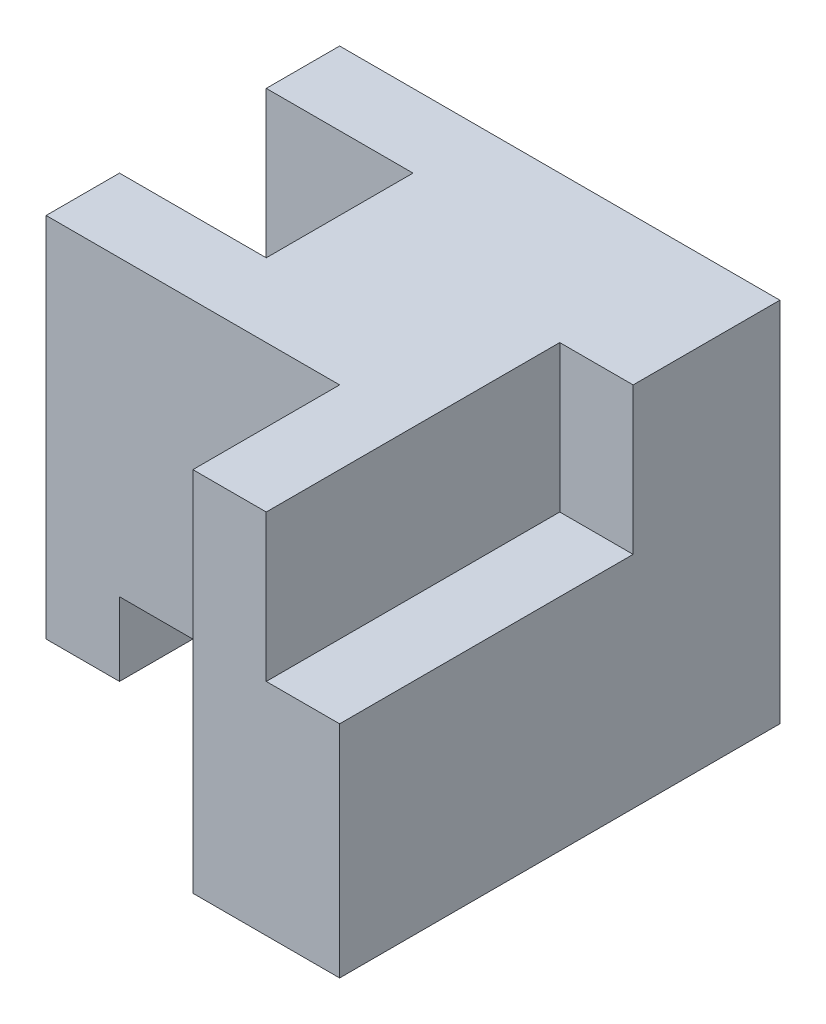
ISO-10303-21;
HEADER;
FILE_DESCRIPTION(('STEP AP214'),'2;1');
FILE_NAME('part.step','',(''),(''),'','','');
FILE_SCHEMA(('AUTOMOTIVE_DESIGN { 1 0 10303 214 1 1 1 1 }'));
ENDSEC;
DATA;
#1=APPLICATION_CONTEXT('core data for automotive mechanical design processes');
#2=APPLICATION_PROTOCOL_DEFINITION('international standard','automotive_design',2000,#1);
#3=PRODUCT_CONTEXT('',#1,'mechanical');
#4=PRODUCT('Part','Part','',(#3));
#5=PRODUCT_RELATED_PRODUCT_CATEGORY('part','',(#4));
#6=PRODUCT_DEFINITION_FORMATION('','',#4);
#7=PRODUCT_DEFINITION_CONTEXT('part definition',#1,'design');
#8=PRODUCT_DEFINITION('design','',#6,#7);
#9=PRODUCT_DEFINITION_SHAPE('','',#8);
#10=(LENGTH_UNIT() NAMED_UNIT(*) SI_UNIT(.MILLI.,.METRE.));
#11=(NAMED_UNIT(*) PLANE_ANGLE_UNIT() SI_UNIT($,.RADIAN.));
#12=(NAMED_UNIT(*) SI_UNIT($,.STERADIAN.) SOLID_ANGLE_UNIT());
#13=UNCERTAINTY_MEASURE_WITH_UNIT(LENGTH_MEASURE(1.E-05),#10,'distance_accuracy_value','');
#14=(GEOMETRIC_REPRESENTATION_CONTEXT(3) GLOBAL_UNCERTAINTY_ASSIGNED_CONTEXT((#13)) GLOBAL_UNIT_ASSIGNED_CONTEXT((#10,
#11,#12)) REPRESENTATION_CONTEXT('',''));
#15=CARTESIAN_POINT('',(0.,0.,0.));
#16=DIRECTION('',(0.,0.,1.));
#17=DIRECTION('',(1.,0.,0.));
#18=AXIS2_PLACEMENT_3D('',#15,#16,#17);
#19=CARTESIAN_POINT('',(80.,0.,120.));
#20=DIRECTION('',(-1.,0.,0.));
#21=DIRECTION('',(0.,0.,1.));
#22=AXIS2_PLACEMENT_3D('',#19,#20,#21);
#23=PLANE('',#22);
#24=DIRECTION('',(0.,0.,-1.));
#25=VECTOR('',#24,1.);
#26=CARTESIAN_POINT('',(80.,100.,120.));
#27=LINE('',#26,#25);
#28=CARTESIAN_POINT('',(80.,100.,120.));
#29=VERTEX_POINT('',#28);
#30=CARTESIAN_POINT('',(80.,100.,-40.));
#31=VERTEX_POINT('',#30);
#32=EDGE_CURVE('E248',#29,#31,#27,.T.);
#33=ORIENTED_EDGE('',*,*,#32,.F.);
#34=DIRECTION('',(0.,1.,0.));
#35=VECTOR('',#34,1.);
#36=CARTESIAN_POINT('',(80.,0.,120.));
#37=LINE('',#36,#35);
#38=CARTESIAN_POINT('',(80.,20.,120.));
#39=VERTEX_POINT('',#38);
#40=EDGE_CURVE('E196',#39,#29,#37,.T.);
#41=ORIENTED_EDGE('',*,*,#40,.F.);
#42=DIRECTION('',(0.,0.,-1.));
#43=VECTOR('',#42,1.);
#44=CARTESIAN_POINT('',(80.,20.,120.));
#45=LINE('',#44,#43);
#46=CARTESIAN_POINT('',(80.,20.,-40.));
#47=VERTEX_POINT('',#46);
#48=EDGE_CURVE('E250',#39,#47,#45,.T.);
#49=ORIENTED_EDGE('',*,*,#48,.T.);
#50=DIRECTION('',(0.,-1.,0.));
#51=VECTOR('',#50,1.);
#52=CARTESIAN_POINT('',(80.,100.,-40.));
#53=LINE('',#52,#51);
#54=EDGE_CURVE('E229',#31,#47,#53,.T.);
#55=ORIENTED_EDGE('',*,*,#54,.F.);
#56=EDGE_LOOP('',(#33,#41,#49,#55));
#57=FACE_BOUND('',#56,.T.);
#58=ADVANCED_FACE('F38',(#57),#23,.F.);
#59=CARTESIAN_POINT('',(120.,100.,-40.));
#60=DIRECTION('',(0.,0.,-1.));
#61=DIRECTION('',(-1.,0.,0.));
#62=AXIS2_PLACEMENT_3D('',#59,#60,#61);
#63=PLANE('',#62);
#64=ORIENTED_EDGE('',*,*,#54,.T.);
#65=DIRECTION('',(-1.,0.,0.));
#66=VECTOR('',#65,1.);
#67=CARTESIAN_POINT('',(120.,20.,-40.));
#68=LINE('',#67,#66);
#69=CARTESIAN_POINT('',(120.,20.,-40.));
#70=VERTEX_POINT('',#69);
#71=EDGE_CURVE('E240',#70,#47,#68,.T.);
#72=ORIENTED_EDGE('',*,*,#71,.F.);
#73=DIRECTION('',(0.,-1.,0.));
#74=VECTOR('',#73,1.);
#75=CARTESIAN_POINT('',(120.,100.,-40.));
#76=LINE('',#75,#74);
#77=CARTESIAN_POINT('',(120.,100.,-40.));
#78=VERTEX_POINT('',#77);
#79=EDGE_CURVE('E237',#78,#70,#76,.T.);
#80=ORIENTED_EDGE('',*,*,#79,.F.);
#81=DIRECTION('',(-1.,0.,0.));
#82=VECTOR('',#81,1.);
#83=CARTESIAN_POINT('',(120.,100.,-40.));
#84=LINE('',#83,#82);
#85=EDGE_CURVE('E245',#78,#31,#84,.T.);
#86=ORIENTED_EDGE('',*,*,#85,.T.);
#87=EDGE_LOOP('',(#64,#72,#80,#86));
#88=FACE_BOUND('',#87,.T.);
#89=ADVANCED_FACE('F330',(#88),#63,.F.);
#90=CARTESIAN_POINT('',(40.,0.,120.));
#91=DIRECTION('',(1.,0.,0.));
#92=DIRECTION('',(0.,1.,0.));
#93=AXIS2_PLACEMENT_3D('',#90,#91,#92);
#94=PLANE('',#93);
#95=DIRECTION('',(0.,0.,-1.));
#96=VECTOR('',#95,1.);
#97=CARTESIAN_POINT('',(40.,-100.,120.));
#98=LINE('',#97,#96);
#99=CARTESIAN_POINT('',(40.,-100.,120.));
#100=VERTEX_POINT('',#99);
#101=CARTESIAN_POINT('',(40.,-100.,-120.));
#102=VERTEX_POINT('',#101);
#103=EDGE_CURVE('E256',#100,#102,#98,.T.);
#104=ORIENTED_EDGE('',*,*,#103,.F.);
#105=DIRECTION('',(0.,-1.,0.));
#106=VECTOR('',#105,1.);
#107=CARTESIAN_POINT('',(40.,0.,120.));
#108=LINE('',#107,#106);
#109=CARTESIAN_POINT('',(40.,100.,120.));
#110=VERTEX_POINT('',#109);
#111=EDGE_CURVE('E167',#110,#100,#108,.T.);
#112=ORIENTED_EDGE('',*,*,#111,.F.);
#113=DIRECTION('',(0.,0.,-1.));
#114=VECTOR('',#113,1.);
#115=CARTESIAN_POINT('',(40.,100.,120.));
#116=LINE('',#115,#114);
#117=CARTESIAN_POINT('',(40.,100.,40.));
#118=VERTEX_POINT('',#117);
#119=EDGE_CURVE('E156',#110,#118,#116,.T.);
#120=ORIENTED_EDGE('',*,*,#119,.T.);
#121=DIRECTION('',(0.,-1.,0.));
#122=VECTOR('',#121,1.);
#123=CARTESIAN_POINT('',(40.,0.,40.));
#124=LINE('',#123,#122);
#125=CARTESIAN_POINT('',(40.,-60.,40.));
#126=VERTEX_POINT('',#125);
#127=EDGE_CURVE('E182',#118,#126,#124,.T.);
#128=ORIENTED_EDGE('',*,*,#127,.T.);
#129=DIRECTION('',(0.,0.,-1.));
#130=VECTOR('',#129,1.);
#131=CARTESIAN_POINT('',(40.,-60.,40.));
#132=LINE('',#131,#130);
#133=CARTESIAN_POINT('',(40.,-60.,-120.));
#134=VERTEX_POINT('',#133);
#135=EDGE_CURVE('E213',#126,#134,#132,.T.);
#136=ORIENTED_EDGE('',*,*,#135,.T.);
#137=DIRECTION('',(0.,-1.,0.));
#138=VECTOR('',#137,1.);
#139=CARTESIAN_POINT('',(40.,0.,-120.));
#140=LINE('',#139,#138);
#141=EDGE_CURVE('E290',#134,#102,#140,.T.);
#142=ORIENTED_EDGE('',*,*,#141,.T.);
#143=EDGE_LOOP('',(#104,#112,#120,#128,#136,#142));
#144=FACE_BOUND('',#143,.T.);
#145=ADVANCED_FACE('F211',(#144),#94,.F.);
#146=CARTESIAN_POINT('',(0.,100.,120.));
#147=DIRECTION('',(0.,-1.,0.));
#148=DIRECTION('',(1.,0.,0.));
#149=AXIS2_PLACEMENT_3D('',#146,#147,#148);
#150=PLANE('',#149);
#151=DIRECTION('',(0.,0.,1.));
#152=VECTOR('',#151,1.);
#153=CARTESIAN_POINT('',(120.,100.,-40.));
#154=LINE('',#153,#152);
#155=CARTESIAN_POINT('',(120.,100.,-120.));
#156=VERTEX_POINT('',#155);
#157=EDGE_CURVE('E235',#156,#78,#154,.T.);
#158=ORIENTED_EDGE('',*,*,#157,.F.);
#159=DIRECTION('',(-1.,0.,0.));
#160=VECTOR('',#159,1.);
#161=CARTESIAN_POINT('',(0.,100.,-120.));
#162=LINE('',#161,#160);
#163=CARTESIAN_POINT('',(-120.,100.,-120.));
#164=VERTEX_POINT('',#163);
#165=EDGE_CURVE('E284',#156,#164,#162,.T.);
#166=ORIENTED_EDGE('',*,*,#165,.T.);
#167=DIRECTION('',(0.,0.,-1.));
#168=VECTOR('',#167,1.);
#169=CARTESIAN_POINT('',(-120.,100.,40.));
#170=LINE('',#169,#168);
#171=CARTESIAN_POINT('',(-120.,100.,-80.));
#172=VERTEX_POINT('',#171);
#173=EDGE_CURVE('E282',#172,#164,#170,.T.);
#174=ORIENTED_EDGE('',*,*,#173,.F.);
#175=DIRECTION('',(-1.,0.,0.));
#176=VECTOR('',#175,1.);
#177=CARTESIAN_POINT('',(0.,100.,-80.));
#178=LINE('',#177,#176);
#179=CARTESIAN_POINT('',(-39.9999999999997,100.,-80.));
#180=VERTEX_POINT('',#179);
#181=EDGE_CURVE('E271',#180,#172,#178,.T.);
#182=ORIENTED_EDGE('',*,*,#181,.F.);
#183=DIRECTION('',(0.,0.,1.));
#184=VECTOR('',#183,1.);
#185=CARTESIAN_POINT('',(-39.9999999999997,100.,120.));
#186=LINE('',#185,#184);
#187=CARTESIAN_POINT('',(-39.9999999999997,100.,0.));
#188=VERTEX_POINT('',#187);
#189=EDGE_CURVE('E47',#180,#188,#186,.T.);
#190=ORIENTED_EDGE('',*,*,#189,.T.);
#191=DIRECTION('',(-1.,0.,0.));
#192=VECTOR('',#191,1.);
#193=CARTESIAN_POINT('',(0.,100.,0.));
#194=LINE('',#193,#192);
#195=CARTESIAN_POINT('',(-120.,100.,0.));
#196=VERTEX_POINT('',#195);
#197=EDGE_CURVE('E144',#188,#196,#194,.T.);
#198=ORIENTED_EDGE('',*,*,#197,.T.);
#199=DIRECTION('',(0.,0.,-1.));
#200=VECTOR('',#199,1.);
#201=CARTESIAN_POINT('',(-120.,100.,40.));
#202=LINE('',#201,#200);
#203=CARTESIAN_POINT('',(-120.,100.,40.));
#204=VERTEX_POINT('',#203);
#205=EDGE_CURVE('E148',#204,#196,#202,.T.);
#206=ORIENTED_EDGE('',*,*,#205,.F.);
#207=DIRECTION('',(-1.,0.,0.));
#208=VECTOR('',#207,1.);
#209=CARTESIAN_POINT('',(0.,100.,40.));
#210=LINE('',#209,#208);
#211=EDGE_CURVE('E183',#118,#204,#210,.T.);
#212=ORIENTED_EDGE('',*,*,#211,.F.);
#213=ORIENTED_EDGE('',*,*,#119,.F.);
#214=DIRECTION('',(-1.,0.,0.));
#215=VECTOR('',#214,1.);
#216=CARTESIAN_POINT('',(0.,100.,120.));
#217=LINE('',#216,#215);
#218=EDGE_CURVE('E162',#29,#110,#217,.T.);
#219=ORIENTED_EDGE('',*,*,#218,.F.);
#220=ORIENTED_EDGE('',*,*,#32,.T.);
#221=ORIENTED_EDGE('',*,*,#85,.F.);
#222=EDGE_LOOP('',(#158,#166,#174,#182,#190,#198,#206,#212,#213,#219,#220,#221));
#223=FACE_BOUND('',#222,.T.);
#224=ADVANCED_FACE('F146',(#223),#150,.F.);
#225=CARTESIAN_POINT('',(-120.,0.,40.));
#226=DIRECTION('',(1.,0.,0.));
#227=DIRECTION('',(0.,0.,-1.));
#228=AXIS2_PLACEMENT_3D('',#225,#226,#227);
#229=PLANE('',#228);
#230=DIRECTION('',(0.,0.,-1.));
#231=VECTOR('',#230,1.);
#232=CARTESIAN_POINT('',(-120.,-100.,40.));
#233=LINE('',#232,#231);
#234=CARTESIAN_POINT('',(-120.,-100.,40.));
#235=VERTEX_POINT('',#234);
#236=CARTESIAN_POINT('',(-120.,-100.,-120.));
#237=VERTEX_POINT('',#236);
#238=EDGE_CURVE('E227',#235,#237,#233,.T.);
#239=ORIENTED_EDGE('',*,*,#238,.F.);
#240=DIRECTION('',(0.,-1.,0.));
#241=VECTOR('',#240,1.);
#242=CARTESIAN_POINT('',(-120.,0.,40.));
#243=LINE('',#242,#241);
#244=EDGE_CURVE('E160',#204,#235,#243,.T.);
#245=ORIENTED_EDGE('',*,*,#244,.F.);
#246=ORIENTED_EDGE('',*,*,#205,.T.);
#247=DIRECTION('',(0.,-1.,0.));
#248=VECTOR('',#247,1.);
#249=CARTESIAN_POINT('',(-120.,0.,0.));
#250=LINE('',#249,#248);
#251=CARTESIAN_POINT('',(-120.,20.,0.));
#252=VERTEX_POINT('',#251);
#253=EDGE_CURVE('E151',#196,#252,#250,.T.);
#254=ORIENTED_EDGE('',*,*,#253,.T.);
#255=DIRECTION('',(0.,0.,-1.));
#256=VECTOR('',#255,1.);
#257=CARTESIAN_POINT('',(-120.,20.,40.));
#258=LINE('',#257,#256);
#259=CARTESIAN_POINT('',(-120.,20.,-80.));
#260=VERTEX_POINT('',#259);
#261=EDGE_CURVE('E258',#252,#260,#258,.T.);
#262=ORIENTED_EDGE('',*,*,#261,.T.);
#263=DIRECTION('',(0.,-1.,0.));
#264=VECTOR('',#263,1.);
#265=CARTESIAN_POINT('',(-120.,0.,-80.));
#266=LINE('',#265,#264);
#267=EDGE_CURVE('E178',#172,#260,#266,.T.);
#268=ORIENTED_EDGE('',*,*,#267,.F.);
#269=ORIENTED_EDGE('',*,*,#173,.T.);
#270=DIRECTION('',(0.,-1.,0.));
#271=VECTOR('',#270,1.);
#272=CARTESIAN_POINT('',(-120.,0.,-120.));
#273=LINE('',#272,#271);
#274=EDGE_CURVE('E288',#164,#237,#273,.T.);
#275=ORIENTED_EDGE('',*,*,#274,.T.);
#276=EDGE_LOOP('',(#239,#245,#246,#254,#262,#268,#269,#275));
#277=FACE_BOUND('',#276,.T.);
#278=ADVANCED_FACE('F158',(#277),#229,.F.);
#279=CARTESIAN_POINT('',(-79.9999999999999,0.,40.));
#280=DIRECTION('',(-1.,0.,0.));
#281=DIRECTION('',(0.,0.,1.));
#282=AXIS2_PLACEMENT_3D('',#279,#280,#281);
#283=PLANE('',#282);
#284=DIRECTION('',(0.,0.,-1.));
#285=VECTOR('',#284,1.);
#286=CARTESIAN_POINT('',(-79.9999999999999,-60.,40.));
#287=LINE('',#286,#285);
#288=CARTESIAN_POINT('',(-79.9999999999999,-60.,40.));
#289=VERTEX_POINT('',#288);
#290=CARTESIAN_POINT('',(-79.9999999999999,-60.,-120.));
#291=VERTEX_POINT('',#290);
#292=EDGE_CURVE('E223',#289,#291,#287,.T.);
#293=ORIENTED_EDGE('',*,*,#292,.F.);
#294=DIRECTION('',(0.,1.,0.));
#295=VECTOR('',#294,1.);
#296=CARTESIAN_POINT('',(-79.9999999999999,0.,40.));
#297=LINE('',#296,#295);
#298=CARTESIAN_POINT('',(-79.9999999999999,-100.,40.));
#299=VERTEX_POINT('',#298);
#300=EDGE_CURVE('E175',#299,#289,#297,.T.);
#301=ORIENTED_EDGE('',*,*,#300,.F.);
#302=DIRECTION('',(0.,0.,-1.));
#303=VECTOR('',#302,1.);
#304=CARTESIAN_POINT('',(-79.9999999999999,-100.,40.));
#305=LINE('',#304,#303);
#306=CARTESIAN_POINT('',(-79.9999999999999,-100.,-120.));
#307=VERTEX_POINT('',#306);
#308=EDGE_CURVE('E231',#299,#307,#305,.T.);
#309=ORIENTED_EDGE('',*,*,#308,.T.);
#310=DIRECTION('',(0.,1.,0.));
#311=VECTOR('',#310,1.);
#312=CARTESIAN_POINT('',(-79.9999999999999,0.,-120.));
#313=LINE('',#312,#311);
#314=EDGE_CURVE('E299',#307,#291,#313,.T.);
#315=ORIENTED_EDGE('',*,*,#314,.T.);
#316=EDGE_LOOP('',(#293,#301,#309,#315));
#317=FACE_BOUND('',#316,.T.);
#318=ADVANCED_FACE('F304',(#317),#283,.F.);
#319=CARTESIAN_POINT('',(0.,-100.,40.));
#320=DIRECTION('',(0.,-1.,0.));
#321=DIRECTION('',(1.,0.,0.));
#322=AXIS2_PLACEMENT_3D('',#319,#320,#321);
#323=PLANE('',#322);
#324=ORIENTED_EDGE('',*,*,#308,.F.);
#325=DIRECTION('',(-1.,0.,0.));
#326=VECTOR('',#325,1.);
#327=CARTESIAN_POINT('',(0.,-100.,40.));
#328=LINE('',#327,#326);
#329=EDGE_CURVE('E161',#299,#235,#328,.T.);
#330=ORIENTED_EDGE('',*,*,#329,.T.);
#331=ORIENTED_EDGE('',*,*,#238,.T.);
#332=DIRECTION('',(-1.,0.,0.));
#333=VECTOR('',#332,1.);
#334=CARTESIAN_POINT('',(0.,-100.,-120.));
#335=LINE('',#334,#333);
#336=EDGE_CURVE('E283',#307,#237,#335,.T.);
#337=ORIENTED_EDGE('',*,*,#336,.F.);
#338=EDGE_LOOP('',(#324,#330,#331,#337));
#339=FACE_BOUND('',#338,.T.);
#340=ADVANCED_FACE('F306',(#339),#323,.T.);
#341=CARTESIAN_POINT('',(0.,-60.,40.));
#342=DIRECTION('',(0.,1.,0.));
#343=DIRECTION('',(-1.,0.,0.));
#344=AXIS2_PLACEMENT_3D('',#341,#342,#343);
#345=PLANE('',#344);
#346=ORIENTED_EDGE('',*,*,#135,.F.);
#347=DIRECTION('',(1.,0.,0.));
#348=VECTOR('',#347,1.);
#349=CARTESIAN_POINT('',(0.,-60.,40.));
#350=LINE('',#349,#348);
#351=EDGE_CURVE('E179',#289,#126,#350,.T.);
#352=ORIENTED_EDGE('',*,*,#351,.F.);
#353=ORIENTED_EDGE('',*,*,#292,.T.);
#354=DIRECTION('',(1.,0.,0.));
#355=VECTOR('',#354,1.);
#356=CARTESIAN_POINT('',(0.,-60.,-120.));
#357=LINE('',#356,#355);
#358=EDGE_CURVE('E225',#291,#134,#357,.T.);
#359=ORIENTED_EDGE('',*,*,#358,.T.);
#360=EDGE_LOOP('',(#346,#352,#353,#359));
#361=FACE_BOUND('',#360,.T.);
#362=ADVANCED_FACE('F222',(#361),#345,.F.);
#363=CARTESIAN_POINT('',(0.,-100.,120.));
#364=DIRECTION('',(0.,-1.,0.));
#365=DIRECTION('',(1.,0.,0.));
#366=AXIS2_PLACEMENT_3D('',#363,#364,#365);
#367=PLANE('',#366);
#368=DIRECTION('',(0.,0.,-1.));
#369=VECTOR('',#368,1.);
#370=CARTESIAN_POINT('',(120.,-100.,120.));
#371=LINE('',#370,#369);
#372=CARTESIAN_POINT('',(120.,-100.,120.));
#373=VERTEX_POINT('',#372);
#374=CARTESIAN_POINT('',(120.,-100.,-120.));
#375=VERTEX_POINT('',#374);
#376=EDGE_CURVE('E254',#373,#375,#371,.T.);
#377=ORIENTED_EDGE('',*,*,#376,.F.);
#378=DIRECTION('',(-1.,0.,0.));
#379=VECTOR('',#378,1.);
#380=CARTESIAN_POINT('',(0.,-100.,120.));
#381=LINE('',#380,#379);
#382=EDGE_CURVE('E187',#373,#100,#381,.T.);
#383=ORIENTED_EDGE('',*,*,#382,.T.);
#384=ORIENTED_EDGE('',*,*,#103,.T.);
#385=DIRECTION('',(-1.,0.,0.));
#386=VECTOR('',#385,1.);
#387=CARTESIAN_POINT('',(0.,-100.,-120.));
#388=LINE('',#387,#386);
#389=EDGE_CURVE('E294',#375,#102,#388,.T.);
#390=ORIENTED_EDGE('',*,*,#389,.F.);
#391=EDGE_LOOP('',(#377,#383,#384,#390));
#392=FACE_BOUND('',#391,.T.);
#393=ADVANCED_FACE('F318',(#392),#367,.T.);
#394=CARTESIAN_POINT('',(0.,20.,120.));
#395=DIRECTION('',(0.,-1.,0.));
#396=DIRECTION('',(1.,0.,0.));
#397=AXIS2_PLACEMENT_3D('',#394,#395,#396);
#398=PLANE('',#397);
#399=ORIENTED_EDGE('',*,*,#48,.F.);
#400=DIRECTION('',(-1.,0.,0.));
#401=VECTOR('',#400,1.);
#402=CARTESIAN_POINT('',(0.,20.,120.));
#403=LINE('',#402,#401);
#404=CARTESIAN_POINT('',(120.,20.,120.));
#405=VERTEX_POINT('',#404);
#406=EDGE_CURVE('E193',#405,#39,#403,.T.);
#407=ORIENTED_EDGE('',*,*,#406,.F.);
#408=DIRECTION('',(0.,0.,-1.));
#409=VECTOR('',#408,1.);
#410=CARTESIAN_POINT('',(120.,20.,120.));
#411=LINE('',#410,#409);
#412=EDGE_CURVE('E252',#405,#70,#411,.T.);
#413=ORIENTED_EDGE('',*,*,#412,.T.);
#414=ORIENTED_EDGE('',*,*,#71,.T.);
#415=EDGE_LOOP('',(#399,#407,#413,#414));
#416=FACE_BOUND('',#415,.T.);
#417=ADVANCED_FACE('F332',(#416),#398,.F.);
#418=CARTESIAN_POINT('',(120.,0.,120.));
#419=DIRECTION('',(1.,0.,0.));
#420=DIRECTION('',(0.,1.,0.));
#421=AXIS2_PLACEMENT_3D('',#418,#419,#420);
#422=PLANE('',#421);
#423=ORIENTED_EDGE('',*,*,#412,.F.);
#424=DIRECTION('',(0.,-1.,0.));
#425=VECTOR('',#424,1.);
#426=CARTESIAN_POINT('',(120.,0.,120.));
#427=LINE('',#426,#425);
#428=EDGE_CURVE('E190',#405,#373,#427,.T.);
#429=ORIENTED_EDGE('',*,*,#428,.T.);
#430=ORIENTED_EDGE('',*,*,#376,.T.);
#431=DIRECTION('',(0.,-1.,0.));
#432=VECTOR('',#431,1.);
#433=CARTESIAN_POINT('',(120.,0.,-120.));
#434=LINE('',#433,#432);
#435=EDGE_CURVE('E274',#156,#375,#434,.T.);
#436=ORIENTED_EDGE('',*,*,#435,.F.);
#437=ORIENTED_EDGE('',*,*,#157,.T.);
#438=ORIENTED_EDGE('',*,*,#79,.T.);
#439=EDGE_LOOP('',(#423,#429,#430,#436,#437,#438));
#440=FACE_BOUND('',#439,.T.);
#441=ADVANCED_FACE('F321',(#440),#422,.T.);
#442=CARTESIAN_POINT('',(-120.,20.,40.));
#443=DIRECTION('',(0.707106781186546,-0.707106781186549,0.));
#444=DIRECTION('',(0.,0.,-1.));
#445=AXIS2_PLACEMENT_3D('',#442,#443,#444);
#446=PLANE('',#445);
#447=DIRECTION('',(0.707106781186549,0.707106781186546,0.));
#448=VECTOR('',#447,1.);
#449=CARTESIAN_POINT('',(-180.005,-40.0049999999998,0.));
#450=LINE('',#449,#448);
#451=EDGE_CURVE('E11',#188,#252,#450,.F.);
#452=ORIENTED_EDGE('',*,*,#451,.F.);
#453=ORIENTED_EDGE('',*,*,#189,.F.);
#454=DIRECTION('',(-0.707106781186549,-0.707106781186546,0.));
#455=VECTOR('',#454,1.);
#456=CARTESIAN_POINT('',(-120.,20.,-80.));
#457=LINE('',#456,#455);
#458=EDGE_CURVE('E60',#260,#180,#457,.F.);
#459=ORIENTED_EDGE('',*,*,#458,.F.);
#460=ORIENTED_EDGE('',*,*,#261,.F.);
#461=EDGE_LOOP('',(#452,#453,#459,#460));
#462=FACE_BOUND('',#461,.T.);
#463=ADVANCED_FACE('F40',(#462),#446,.F.);
#464=CARTESIAN_POINT('',(-120.,-100.01,-80.));
#465=DIRECTION('',(0.,0.,1.));
#466=DIRECTION('',(1.,0.,0.));
#467=AXIS2_PLACEMENT_3D('',#464,#465,#466);
#468=PLANE('',#467);
#469=ORIENTED_EDGE('',*,*,#267,.T.);
#470=ORIENTED_EDGE('',*,*,#458,.T.);
#471=ORIENTED_EDGE('',*,*,#181,.T.);
#472=EDGE_LOOP('',(#469,#470,#471));
#473=FACE_BOUND('',#472,.T.);
#474=ADVANCED_FACE('F270',(#473),#468,.T.);
#475=CARTESIAN_POINT('',(0.,0.,-120.));
#476=DIRECTION('',(0.,0.,1.));
#477=DIRECTION('',(1.,0.,0.));
#478=AXIS2_PLACEMENT_3D('',#475,#476,#477);
#479=PLANE('',#478);
#480=ORIENTED_EDGE('',*,*,#165,.F.);
#481=ORIENTED_EDGE('',*,*,#435,.T.);
#482=ORIENTED_EDGE('',*,*,#389,.T.);
#483=ORIENTED_EDGE('',*,*,#141,.F.);
#484=ORIENTED_EDGE('',*,*,#358,.F.);
#485=ORIENTED_EDGE('',*,*,#314,.F.);
#486=ORIENTED_EDGE('',*,*,#336,.T.);
#487=ORIENTED_EDGE('',*,*,#274,.F.);
#488=EDGE_LOOP('',(#480,#481,#482,#483,#484,#485,#486,#487));
#489=FACE_BOUND('',#488,.T.);
#490=ADVANCED_FACE('F308',(#489),#479,.F.);
#491=CARTESIAN_POINT('',(-120.,-100.01,0.));
#492=DIRECTION('',(0.,0.,1.));
#493=DIRECTION('',(1.,0.,0.));
#494=AXIS2_PLACEMENT_3D('',#491,#492,#493);
#495=PLANE('',#494);
#496=ORIENTED_EDGE('',*,*,#197,.F.);
#497=ORIENTED_EDGE('',*,*,#451,.T.);
#498=ORIENTED_EDGE('',*,*,#253,.F.);
#499=EDGE_LOOP('',(#496,#497,#498));
#500=FACE_BOUND('',#499,.T.);
#501=ADVANCED_FACE('F154',(#500),#495,.F.);
#502=CARTESIAN_POINT('',(0.,0.,120.));
#503=DIRECTION('',(0.,0.,1.));
#504=DIRECTION('',(1.,0.,0.));
#505=AXIS2_PLACEMENT_3D('',#502,#503,#504);
#506=PLANE('',#505);
#507=ORIENTED_EDGE('',*,*,#218,.T.);
#508=ORIENTED_EDGE('',*,*,#111,.T.);
#509=ORIENTED_EDGE('',*,*,#382,.F.);
#510=ORIENTED_EDGE('',*,*,#428,.F.);
#511=ORIENTED_EDGE('',*,*,#406,.T.);
#512=ORIENTED_EDGE('',*,*,#40,.T.);
#513=EDGE_LOOP('',(#507,#508,#509,#510,#511,#512));
#514=FACE_BOUND('',#513,.T.);
#515=ADVANCED_FACE('F315',(#514),#506,.T.);
#516=CARTESIAN_POINT('',(0.,0.,40.));
#517=DIRECTION('',(0.,0.,1.));
#518=DIRECTION('',(1.,0.,0.));
#519=AXIS2_PLACEMENT_3D('',#516,#517,#518);
#520=PLANE('',#519);
#521=ORIENTED_EDGE('',*,*,#300,.T.);
#522=ORIENTED_EDGE('',*,*,#351,.T.);
#523=ORIENTED_EDGE('',*,*,#127,.F.);
#524=ORIENTED_EDGE('',*,*,#211,.T.);
#525=ORIENTED_EDGE('',*,*,#244,.T.);
#526=ORIENTED_EDGE('',*,*,#329,.F.);
#527=EDGE_LOOP('',(#521,#522,#523,#524,#525,#526));
#528=FACE_BOUND('',#527,.T.);
#529=ADVANCED_FACE('F217',(#528),#520,.T.);
#530=CLOSED_SHELL('',(#58,#89,#145,#224,#278,#318,#340,#362,#393,#417,#441,#463,#474,#490,#501,
#515,#529));
#531=MANIFOLD_SOLID_BREP('B2',#530);
#532=ADVANCED_BREP_SHAPE_REPRESENTATION('',(#18,#531),#14);
#533=SHAPE_DEFINITION_REPRESENTATION(#9,#532);
ENDSEC;
END-ISO-10303-21;
